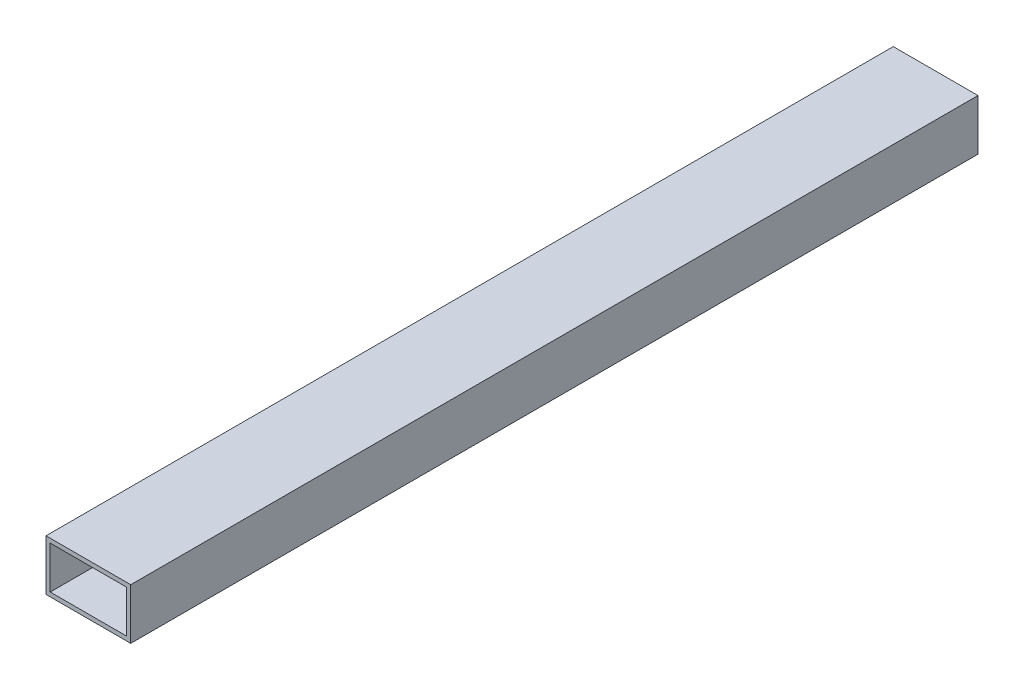
ISO-10303-21;
HEADER;
FILE_DESCRIPTION(('STEP AP214'),'2;1');
FILE_NAME('part.step','',(''),(''),'','','');
FILE_SCHEMA(('AUTOMOTIVE_DESIGN { 1 0 10303 214 1 1 1 1 }'));
ENDSEC;
DATA;
#1=APPLICATION_CONTEXT('core data for automotive mechanical design processes');
#2=APPLICATION_PROTOCOL_DEFINITION('international standard','automotive_design',2000,#1);
#3=PRODUCT_CONTEXT('',#1,'mechanical');
#4=PRODUCT('Part','Part','',(#3));
#5=PRODUCT_RELATED_PRODUCT_CATEGORY('part','',(#4));
#6=PRODUCT_DEFINITION_FORMATION('','',#4);
#7=PRODUCT_DEFINITION_CONTEXT('part definition',#1,'design');
#8=PRODUCT_DEFINITION('design','',#6,#7);
#9=PRODUCT_DEFINITION_SHAPE('','',#8);
#10=(LENGTH_UNIT() NAMED_UNIT(*) SI_UNIT(.MILLI.,.METRE.));
#11=(NAMED_UNIT(*) PLANE_ANGLE_UNIT() SI_UNIT($,.RADIAN.));
#12=(NAMED_UNIT(*) SI_UNIT($,.STERADIAN.) SOLID_ANGLE_UNIT());
#13=UNCERTAINTY_MEASURE_WITH_UNIT(LENGTH_MEASURE(1.E-05),#10,'distance_accuracy_value','');
#14=(GEOMETRIC_REPRESENTATION_CONTEXT(3) GLOBAL_UNCERTAINTY_ASSIGNED_CONTEXT((#13)) GLOBAL_UNIT_ASSIGNED_CONTEXT((#10,
#11,#12)) REPRESENTATION_CONTEXT('',''));
#15=CARTESIAN_POINT('',(0.,0.,0.));
#16=DIRECTION('',(0.,0.,1.));
#17=DIRECTION('',(1.,0.,0.));
#18=AXIS2_PLACEMENT_3D('',#15,#16,#17);
#19=CARTESIAN_POINT('',(0.,0.,250.));
#20=DIRECTION('',(0.,0.,-1.));
#21=DIRECTION('',(-1.,0.,0.));
#22=AXIS2_PLACEMENT_3D('',#19,#20,#21);
#23=PLANE('',#22);
#24=DIRECTION('',(0.,1.,0.));
#25=VECTOR('',#24,1.);
#26=CARTESIAN_POINT('',(25.,-15.,250.));
#27=LINE('',#26,#25);
#28=CARTESIAN_POINT('',(25.,-15.,250.));
#29=VERTEX_POINT('',#28);
#30=CARTESIAN_POINT('',(25.,15.,250.));
#31=VERTEX_POINT('',#30);
#32=EDGE_CURVE('E142',#29,#31,#27,.T.);
#33=ORIENTED_EDGE('',*,*,#32,.T.);
#34=DIRECTION('',(-1.,0.,0.));
#35=VECTOR('',#34,1.);
#36=CARTESIAN_POINT('',(-25.,15.,250.));
#37=LINE('',#36,#35);
#38=CARTESIAN_POINT('',(-25.,15.,250.));
#39=VERTEX_POINT('',#38);
#40=EDGE_CURVE('E145',#31,#39,#37,.T.);
#41=ORIENTED_EDGE('',*,*,#40,.T.);
#42=DIRECTION('',(0.,-1.,0.));
#43=VECTOR('',#42,1.);
#44=CARTESIAN_POINT('',(-25.,-15.,250.));
#45=LINE('',#44,#43);
#46=CARTESIAN_POINT('',(-25.,-15.,250.));
#47=VERTEX_POINT('',#46);
#48=EDGE_CURVE('E148',#39,#47,#45,.T.);
#49=ORIENTED_EDGE('',*,*,#48,.T.);
#50=DIRECTION('',(1.,0.,0.));
#51=VECTOR('',#50,1.);
#52=CARTESIAN_POINT('',(-25.,-15.,250.));
#53=LINE('',#52,#51);
#54=EDGE_CURVE('E150',#47,#29,#53,.T.);
#55=ORIENTED_EDGE('',*,*,#54,.T.);
#56=EDGE_LOOP('',(#33,#41,#49,#55));
#57=FACE_BOUND('',#56,.T.);
#58=DIRECTION('',(1.,0.,0.));
#59=VECTOR('',#58,1.);
#60=CARTESIAN_POINT('',(-22.5,-12.5,250.));
#61=LINE('',#60,#59);
#62=CARTESIAN_POINT('',(-22.5,-12.5,250.));
#63=VERTEX_POINT('',#62);
#64=CARTESIAN_POINT('',(22.5,-12.5,250.));
#65=VERTEX_POINT('',#64);
#66=EDGE_CURVE('E106',#63,#65,#61,.T.);
#67=ORIENTED_EDGE('',*,*,#66,.F.);
#68=DIRECTION('',(0.,-1.,0.));
#69=VECTOR('',#68,1.);
#70=CARTESIAN_POINT('',(-22.5,-12.5,250.));
#71=LINE('',#70,#69);
#72=CARTESIAN_POINT('',(-22.5,12.5,250.));
#73=VERTEX_POINT('',#72);
#74=EDGE_CURVE('E128',#73,#63,#71,.T.);
#75=ORIENTED_EDGE('',*,*,#74,.F.);
#76=DIRECTION('',(-1.,0.,0.));
#77=VECTOR('',#76,1.);
#78=CARTESIAN_POINT('',(-22.5,12.5,250.));
#79=LINE('',#78,#77);
#80=CARTESIAN_POINT('',(22.5,12.5,250.));
#81=VERTEX_POINT('',#80);
#82=EDGE_CURVE('E126',#81,#73,#79,.T.);
#83=ORIENTED_EDGE('',*,*,#82,.F.);
#84=DIRECTION('',(0.,1.,0.));
#85=VECTOR('',#84,1.);
#86=CARTESIAN_POINT('',(22.5,-12.5,250.));
#87=LINE('',#86,#85);
#88=EDGE_CURVE('E114',#65,#81,#87,.T.);
#89=ORIENTED_EDGE('',*,*,#88,.F.);
#90=EDGE_LOOP('',(#67,#75,#83,#89));
#91=FACE_BOUND('',#90,.T.);
#92=ADVANCED_FACE('F41',(#57,#91),#23,.F.);
#93=CARTESIAN_POINT('',(0.,0.,-250.));
#94=DIRECTION('',(0.,0.,-1.));
#95=DIRECTION('',(-1.,0.,0.));
#96=AXIS2_PLACEMENT_3D('',#93,#94,#95);
#97=PLANE('',#96);
#98=DIRECTION('',(0.,1.,0.));
#99=VECTOR('',#98,1.);
#100=CARTESIAN_POINT('',(25.,-15.,-250.));
#101=LINE('',#100,#99);
#102=CARTESIAN_POINT('',(25.,-15.,-250.));
#103=VERTEX_POINT('',#102);
#104=CARTESIAN_POINT('',(25.,15.,-250.));
#105=VERTEX_POINT('',#104);
#106=EDGE_CURVE('E122',#103,#105,#101,.T.);
#107=ORIENTED_EDGE('',*,*,#106,.F.);
#108=DIRECTION('',(1.,0.,0.));
#109=VECTOR('',#108,1.);
#110=CARTESIAN_POINT('',(-25.,-15.,-250.));
#111=LINE('',#110,#109);
#112=CARTESIAN_POINT('',(-25.,-15.,-250.));
#113=VERTEX_POINT('',#112);
#114=EDGE_CURVE('E146',#113,#103,#111,.T.);
#115=ORIENTED_EDGE('',*,*,#114,.F.);
#116=DIRECTION('',(0.,-1.,0.));
#117=VECTOR('',#116,1.);
#118=CARTESIAN_POINT('',(-25.,-15.,-250.));
#119=LINE('',#118,#117);
#120=CARTESIAN_POINT('',(-25.,15.,-250.));
#121=VERTEX_POINT('',#120);
#122=EDGE_CURVE('E157',#121,#113,#119,.T.);
#123=ORIENTED_EDGE('',*,*,#122,.F.);
#124=DIRECTION('',(-1.,0.,0.));
#125=VECTOR('',#124,1.);
#126=CARTESIAN_POINT('',(-25.,15.,-250.));
#127=LINE('',#126,#125);
#128=EDGE_CURVE('E155',#105,#121,#127,.T.);
#129=ORIENTED_EDGE('',*,*,#128,.F.);
#130=EDGE_LOOP('',(#107,#115,#123,#129));
#131=FACE_BOUND('',#130,.T.);
#132=DIRECTION('',(0.,-1.,0.));
#133=VECTOR('',#132,1.);
#134=CARTESIAN_POINT('',(-22.5,-12.5,-250.));
#135=LINE('',#134,#133);
#136=CARTESIAN_POINT('',(-22.5,12.5,-250.));
#137=VERTEX_POINT('',#136);
#138=CARTESIAN_POINT('',(-22.5,-12.5,-250.));
#139=VERTEX_POINT('',#138);
#140=EDGE_CURVE('E115',#137,#139,#135,.T.);
#141=ORIENTED_EDGE('',*,*,#140,.T.);
#142=DIRECTION('',(1.,0.,0.));
#143=VECTOR('',#142,1.);
#144=CARTESIAN_POINT('',(-22.5,-12.5,-250.));
#145=LINE('',#144,#143);
#146=CARTESIAN_POINT('',(22.5,-12.5,-250.));
#147=VERTEX_POINT('',#146);
#148=EDGE_CURVE('E64',#139,#147,#145,.T.);
#149=ORIENTED_EDGE('',*,*,#148,.T.);
#150=DIRECTION('',(0.,1.,0.));
#151=VECTOR('',#150,1.);
#152=CARTESIAN_POINT('',(22.5,-12.5,-250.));
#153=LINE('',#152,#151);
#154=CARTESIAN_POINT('',(22.5,12.5,-250.));
#155=VERTEX_POINT('',#154);
#156=EDGE_CURVE('E121',#147,#155,#153,.T.);
#157=ORIENTED_EDGE('',*,*,#156,.T.);
#158=DIRECTION('',(-1.,0.,0.));
#159=VECTOR('',#158,1.);
#160=CARTESIAN_POINT('',(-22.5,12.5,-250.));
#161=LINE('',#160,#159);
#162=EDGE_CURVE('E134',#155,#137,#161,.T.);
#163=ORIENTED_EDGE('',*,*,#162,.T.);
#164=EDGE_LOOP('',(#141,#149,#157,#163));
#165=FACE_BOUND('',#164,.T.);
#166=ADVANCED_FACE('F175',(#131,#165),#97,.T.);
#167=CARTESIAN_POINT('',(25.,-15.,250.));
#168=DIRECTION('',(-1.,0.,0.));
#169=DIRECTION('',(0.,0.,1.));
#170=AXIS2_PLACEMENT_3D('',#167,#168,#169);
#171=PLANE('',#170);
#172=ORIENTED_EDGE('',*,*,#106,.T.);
#173=DIRECTION('',(0.,0.,-1.));
#174=VECTOR('',#173,1.);
#175=CARTESIAN_POINT('',(25.,15.,250.));
#176=LINE('',#175,#174);
#177=EDGE_CURVE('E11',#31,#105,#176,.T.);
#178=ORIENTED_EDGE('',*,*,#177,.F.);
#179=ORIENTED_EDGE('',*,*,#32,.F.);
#180=DIRECTION('',(0.,0.,-1.));
#181=VECTOR('',#180,1.);
#182=CARTESIAN_POINT('',(25.,-15.,250.));
#183=LINE('',#182,#181);
#184=EDGE_CURVE('E152',#29,#103,#183,.T.);
#185=ORIENTED_EDGE('',*,*,#184,.T.);
#186=EDGE_LOOP('',(#172,#178,#179,#185));
#187=FACE_BOUND('',#186,.T.);
#188=ADVANCED_FACE('F43',(#187),#171,.F.);
#189=CARTESIAN_POINT('',(-25.,15.,250.));
#190=DIRECTION('',(0.,-1.,0.));
#191=DIRECTION('',(0.,0.,-1.));
#192=AXIS2_PLACEMENT_3D('',#189,#190,#191);
#193=PLANE('',#192);
#194=ORIENTED_EDGE('',*,*,#128,.T.);
#195=DIRECTION('',(0.,0.,-1.));
#196=VECTOR('',#195,1.);
#197=CARTESIAN_POINT('',(-25.,15.,250.));
#198=LINE('',#197,#196);
#199=EDGE_CURVE('E49',#39,#121,#198,.T.);
#200=ORIENTED_EDGE('',*,*,#199,.F.);
#201=ORIENTED_EDGE('',*,*,#40,.F.);
#202=ORIENTED_EDGE('',*,*,#177,.T.);
#203=EDGE_LOOP('',(#194,#200,#201,#202));
#204=FACE_BOUND('',#203,.T.);
#205=ADVANCED_FACE('F185',(#204),#193,.F.);
#206=CARTESIAN_POINT('',(-25.,-15.,250.));
#207=DIRECTION('',(1.,0.,0.));
#208=DIRECTION('',(0.,0.,-1.));
#209=AXIS2_PLACEMENT_3D('',#206,#207,#208);
#210=PLANE('',#209);
#211=ORIENTED_EDGE('',*,*,#122,.T.);
#212=DIRECTION('',(0.,0.,-1.));
#213=VECTOR('',#212,1.);
#214=CARTESIAN_POINT('',(-25.,-15.,250.));
#215=LINE('',#214,#213);
#216=EDGE_CURVE('E162',#47,#113,#215,.T.);
#217=ORIENTED_EDGE('',*,*,#216,.F.);
#218=ORIENTED_EDGE('',*,*,#48,.F.);
#219=ORIENTED_EDGE('',*,*,#199,.T.);
#220=EDGE_LOOP('',(#211,#217,#218,#219));
#221=FACE_BOUND('',#220,.T.);
#222=ADVANCED_FACE('F169',(#221),#210,.F.);
#223=CARTESIAN_POINT('',(-25.,-15.,250.));
#224=DIRECTION('',(0.,1.,0.));
#225=DIRECTION('',(0.,0.,1.));
#226=AXIS2_PLACEMENT_3D('',#223,#224,#225);
#227=PLANE('',#226);
#228=ORIENTED_EDGE('',*,*,#114,.T.);
#229=ORIENTED_EDGE('',*,*,#184,.F.);
#230=ORIENTED_EDGE('',*,*,#54,.F.);
#231=ORIENTED_EDGE('',*,*,#216,.T.);
#232=EDGE_LOOP('',(#228,#229,#230,#231));
#233=FACE_BOUND('',#232,.T.);
#234=ADVANCED_FACE('F179',(#233),#227,.F.);
#235=CARTESIAN_POINT('',(-22.5,-12.5,250.));
#236=DIRECTION('',(0.,1.,0.));
#237=DIRECTION('',(0.,0.,1.));
#238=AXIS2_PLACEMENT_3D('',#235,#236,#237);
#239=PLANE('',#238);
#240=ORIENTED_EDGE('',*,*,#148,.F.);
#241=DIRECTION('',(0.,0.,-1.));
#242=VECTOR('',#241,1.);
#243=CARTESIAN_POINT('',(-22.5,-12.5,250.));
#244=LINE('',#243,#242);
#245=EDGE_CURVE('E110',#63,#139,#244,.T.);
#246=ORIENTED_EDGE('',*,*,#245,.F.);
#247=ORIENTED_EDGE('',*,*,#66,.T.);
#248=DIRECTION('',(0.,0.,-1.));
#249=VECTOR('',#248,1.);
#250=CARTESIAN_POINT('',(22.5,-12.5,250.));
#251=LINE('',#250,#249);
#252=EDGE_CURVE('E109',#65,#147,#251,.T.);
#253=ORIENTED_EDGE('',*,*,#252,.T.);
#254=EDGE_LOOP('',(#240,#246,#247,#253));
#255=FACE_BOUND('',#254,.T.);
#256=ADVANCED_FACE('F108',(#255),#239,.T.);
#257=CARTESIAN_POINT('',(22.5,-12.5,250.));
#258=DIRECTION('',(-1.,0.,0.));
#259=DIRECTION('',(0.,0.,1.));
#260=AXIS2_PLACEMENT_3D('',#257,#258,#259);
#261=PLANE('',#260);
#262=ORIENTED_EDGE('',*,*,#156,.F.);
#263=ORIENTED_EDGE('',*,*,#252,.F.);
#264=ORIENTED_EDGE('',*,*,#88,.T.);
#265=DIRECTION('',(0.,0.,-1.));
#266=VECTOR('',#265,1.);
#267=CARTESIAN_POINT('',(22.5,12.5,250.));
#268=LINE('',#267,#266);
#269=EDGE_CURVE('E123',#81,#155,#268,.T.);
#270=ORIENTED_EDGE('',*,*,#269,.T.);
#271=EDGE_LOOP('',(#262,#263,#264,#270));
#272=FACE_BOUND('',#271,.T.);
#273=ADVANCED_FACE('F118',(#272),#261,.T.);
#274=CARTESIAN_POINT('',(-22.5,12.5,250.));
#275=DIRECTION('',(0.,-1.,0.));
#276=DIRECTION('',(0.,0.,-1.));
#277=AXIS2_PLACEMENT_3D('',#274,#275,#276);
#278=PLANE('',#277);
#279=ORIENTED_EDGE('',*,*,#162,.F.);
#280=ORIENTED_EDGE('',*,*,#269,.F.);
#281=ORIENTED_EDGE('',*,*,#82,.T.);
#282=DIRECTION('',(0.,0.,-1.));
#283=VECTOR('',#282,1.);
#284=CARTESIAN_POINT('',(-22.5,12.5,250.));
#285=LINE('',#284,#283);
#286=EDGE_CURVE('E56',#73,#137,#285,.T.);
#287=ORIENTED_EDGE('',*,*,#286,.T.);
#288=EDGE_LOOP('',(#279,#280,#281,#287));
#289=FACE_BOUND('',#288,.T.);
#290=ADVANCED_FACE('F208',(#289),#278,.T.);
#291=CARTESIAN_POINT('',(-22.5,-12.5,250.));
#292=DIRECTION('',(1.,0.,0.));
#293=DIRECTION('',(0.,0.,-1.));
#294=AXIS2_PLACEMENT_3D('',#291,#292,#293);
#295=PLANE('',#294);
#296=ORIENTED_EDGE('',*,*,#140,.F.);
#297=ORIENTED_EDGE('',*,*,#286,.F.);
#298=ORIENTED_EDGE('',*,*,#74,.T.);
#299=ORIENTED_EDGE('',*,*,#245,.T.);
#300=EDGE_LOOP('',(#296,#297,#298,#299));
#301=FACE_BOUND('',#300,.T.);
#302=ADVANCED_FACE('F212',(#301),#295,.T.);
#303=CLOSED_SHELL('',(#92,#166,#188,#205,#222,#234,#256,#273,#290,#302));
#304=MANIFOLD_SOLID_BREP('B2',#303);
#305=ADVANCED_BREP_SHAPE_REPRESENTATION('',(#18,#304),#14);
#306=SHAPE_DEFINITION_REPRESENTATION(#9,#305);
ENDSEC;
END-ISO-10303-21;
